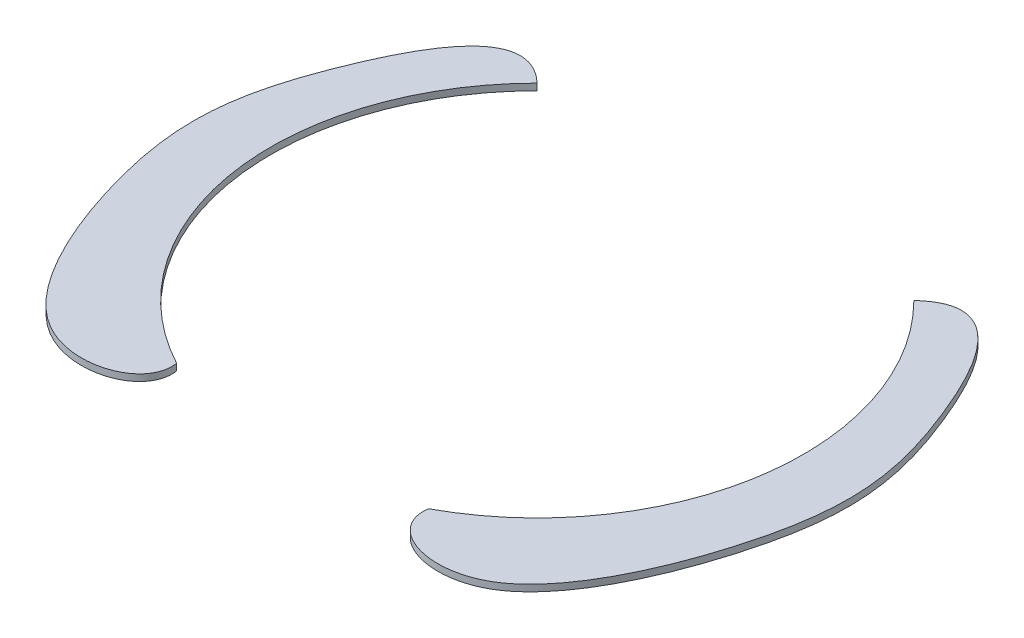
ISO-10303-21;
HEADER;
FILE_DESCRIPTION(('STEP AP214'),'2;1');
FILE_NAME('part.step','',(''),(''),'','','');
FILE_SCHEMA(('AUTOMOTIVE_DESIGN { 1 0 10303 214 1 1 1 1 }'));
ENDSEC;
DATA;
#1=APPLICATION_CONTEXT('core data for automotive mechanical design processes');
#2=APPLICATION_PROTOCOL_DEFINITION('international standard','automotive_design',2000,#1);
#3=PRODUCT_CONTEXT('',#1,'mechanical');
#4=PRODUCT('Part','Part','',(#3));
#5=PRODUCT_RELATED_PRODUCT_CATEGORY('part','',(#4));
#6=PRODUCT_DEFINITION_FORMATION('','',#4);
#7=PRODUCT_DEFINITION_CONTEXT('part definition',#1,'design');
#8=PRODUCT_DEFINITION('design','',#6,#7);
#9=PRODUCT_DEFINITION_SHAPE('','',#8);
#10=(LENGTH_UNIT() NAMED_UNIT(*) SI_UNIT(.MILLI.,.METRE.));
#11=(NAMED_UNIT(*) PLANE_ANGLE_UNIT() SI_UNIT($,.RADIAN.));
#12=(NAMED_UNIT(*) SI_UNIT($,.STERADIAN.) SOLID_ANGLE_UNIT());
#13=UNCERTAINTY_MEASURE_WITH_UNIT(LENGTH_MEASURE(1.E-05),#10,'distance_accuracy_value','');
#14=(GEOMETRIC_REPRESENTATION_CONTEXT(3) GLOBAL_UNCERTAINTY_ASSIGNED_CONTEXT((#13)) GLOBAL_UNIT_ASSIGNED_CONTEXT((#10,
#11,#12)) REPRESENTATION_CONTEXT('',''));
#15=CARTESIAN_POINT('',(0.,0.,0.));
#16=DIRECTION('',(0.,0.,1.));
#17=DIRECTION('',(1.,0.,0.));
#18=AXIS2_PLACEMENT_3D('',#15,#16,#17);
#19=CARTESIAN_POINT('',(120.169206136468,6.35,223.775248623548));
#20=CARTESIAN_POINT('',(114.802406282433,6.35,259.422683492036));
#21=CARTESIAN_POINT('',(224.970761471308,6.35,297.633699589526));
#22=CARTESIAN_POINT('',(324.66087709678,6.35,60.5381654240561));
#23=CARTESIAN_POINT('',(311.192726478503,6.35,-68.2502607321332));
#24=CARTESIAN_POINT('',(227.185128051021,6.35,-224.453544186043));
#25=CARTESIAN_POINT('',(179.605122421383,6.35,-179.605122421383));
#26=B_SPLINE_CURVE_WITH_KNOTS('',3,(#19,#20,#21,#22,#23,#24,#25),.UNSPECIFIED.,.F.,.F.,(4,1,1,1,
4),(0.,0.224498602288113,0.45738299046656,0.765524305542778,1.),.UNSPECIFIED.);
#27=DIRECTION('',(0.,-1.,0.));
#28=VECTOR('',#27,1.);
#29=SURFACE_OF_LINEAR_EXTRUSION('',#26,#28);
#30=CARTESIAN_POINT('',(120.169206136468,0.,223.775248623548));
#31=CARTESIAN_POINT('',(114.802406282433,0.,259.422683492036));
#32=CARTESIAN_POINT('',(224.970761471308,0.,297.633699589526));
#33=CARTESIAN_POINT('',(324.66087709678,0.,60.5381654240561));
#34=CARTESIAN_POINT('',(311.192726478503,0.,-68.2502607321332));
#35=CARTESIAN_POINT('',(227.185128051021,0.,-224.453544186043));
#36=CARTESIAN_POINT('',(179.605122421383,0.,-179.605122421383));
#37=B_SPLINE_CURVE_WITH_KNOTS('',3,(#30,#31,#32,#33,#34,#35,#36),.UNSPECIFIED.,.F.,.F.,(4,1,1,1,
4),(0.,0.224498602288113,0.45738299046656,0.765524305542778,1.),.UNSPECIFIED.);
#38=CARTESIAN_POINT('',(120.169206136468,0.,223.775248623549));
#39=VERTEX_POINT('',#38);
#40=CARTESIAN_POINT('',(179.605122421383,0.,-179.605122421383));
#41=VERTEX_POINT('',#40);
#42=EDGE_CURVE('E79',#39,#41,#37,.T.);
#43=ORIENTED_EDGE('',*,*,#42,.T.);
#44=DIRECTION('',(0.,-1.,0.));
#45=VECTOR('',#44,1.);
#46=CARTESIAN_POINT('',(179.605122421383,6.35,-179.605122421383));
#47=LINE('',#46,#45);
#48=CARTESIAN_POINT('',(179.605122421383,6.35,-179.605122421383));
#49=VERTEX_POINT('',#48);
#50=EDGE_CURVE('E12',#49,#41,#47,.T.);
#51=ORIENTED_EDGE('',*,*,#50,.F.);
#52=CARTESIAN_POINT('',(120.169206136468,6.35,223.775248623549));
#53=VERTEX_POINT('',#52);
#54=EDGE_CURVE('E78',#53,#49,#26,.T.);
#55=ORIENTED_EDGE('',*,*,#54,.F.);
#56=DIRECTION('',(0.,-1.,0.));
#57=VECTOR('',#56,1.);
#58=CARTESIAN_POINT('',(120.169206136468,6.35,223.775248623549));
#59=LINE('',#58,#57);
#60=EDGE_CURVE('E56',#53,#39,#59,.T.);
#61=ORIENTED_EDGE('',*,*,#60,.T.);
#62=EDGE_LOOP('',(#43,#51,#55,#61));
#63=FACE_BOUND('',#62,.T.);
#64=ADVANCED_FACE('F47',(#63),#29,.F.);
#65=CARTESIAN_POINT('',(0.,6.35,0.));
#66=DIRECTION('',(0.,-1.,0.));
#67=DIRECTION('',(0.,0.,-1.));
#68=AXIS2_PLACEMENT_3D('',#65,#66,#67);
#69=CYLINDRICAL_SURFACE('',#68,254.);
#70=CARTESIAN_POINT('',(0.,0.,0.));
#71=DIRECTION('',(0.,-1.,0.));
#72=DIRECTION('',(0.,0.,1.));
#73=AXIS2_PLACEMENT_3D('',#70,#71,#72);
#74=CIRCLE('',#73,254.);
#75=EDGE_CURVE('E71',#41,#39,#74,.T.);
#76=ORIENTED_EDGE('',*,*,#75,.T.);
#77=ORIENTED_EDGE('',*,*,#60,.F.);
#78=CARTESIAN_POINT('',(0.,6.35,0.));
#79=DIRECTION('',(0.,-1.,0.));
#80=DIRECTION('',(0.,0.,1.));
#81=AXIS2_PLACEMENT_3D('',#78,#79,#80);
#82=CIRCLE('',#81,254.);
#83=EDGE_CURVE('E63',#49,#53,#82,.T.);
#84=ORIENTED_EDGE('',*,*,#83,.F.);
#85=ORIENTED_EDGE('',*,*,#50,.T.);
#86=EDGE_LOOP('',(#76,#77,#84,#85));
#87=FACE_BOUND('',#86,.T.);
#88=ADVANCED_FACE('F74',(#87),#69,.F.);
#89=CARTESIAN_POINT('',(307.110628505821,6.35,67.8775018253853));
#90=DIRECTION('',(0.,1.,0.));
#91=DIRECTION('',(0.,0.,1.));
#92=AXIS2_PLACEMENT_3D('',#89,#90,#91);
#93=PLANE('',#92);
#94=ORIENTED_EDGE('',*,*,#54,.T.);
#95=ORIENTED_EDGE('',*,*,#83,.T.);
#96=EDGE_LOOP('',(#94,#95));
#97=FACE_BOUND('',#96,.T.);
#98=ADVANCED_FACE('F96',(#97),#93,.T.);
#99=CARTESIAN_POINT('',(307.110628505821,0.,67.8775018253853));
#100=DIRECTION('',(0.,1.,0.));
#101=DIRECTION('',(0.,0.,1.));
#102=AXIS2_PLACEMENT_3D('',#99,#100,#101);
#103=PLANE('',#102);
#104=ORIENTED_EDGE('',*,*,#42,.F.);
#105=ORIENTED_EDGE('',*,*,#75,.F.);
#106=EDGE_LOOP('',(#104,#105));
#107=FACE_BOUND('',#106,.T.);
#108=ADVANCED_FACE('F82',(#107),#103,.F.);
#109=CLOSED_SHELL('',(#64,#88,#98,#108));
#110=MANIFOLD_SOLID_BREP('B2',#109);
#111=CARTESIAN_POINT('',(-179.605122421383,6.35,-179.605122421383));
#112=CARTESIAN_POINT('',(-227.185128051021,6.35,-224.453544186043));
#113=CARTESIAN_POINT('',(-311.192726478503,6.35,-68.2502607321331));
#114=CARTESIAN_POINT('',(-324.66087709678,6.35,60.5381654240562));
#115=CARTESIAN_POINT('',(-224.970761471308,6.35,297.633699589526));
#116=CARTESIAN_POINT('',(-114.802406282433,6.35,259.422683492036));
#117=CARTESIAN_POINT('',(-120.169206136468,6.35,223.775248623549));
#118=B_SPLINE_CURVE_WITH_KNOTS('',3,(#111,#112,#113,#114,#115,#116,#117),.UNSPECIFIED.,.F.,.F.,
(4,1,1,1,4),(0.,0.234475694457222,0.54261700953344,0.775501397711887,1.),.UNSPECIFIED.);
#119=DIRECTION('',(0.,-1.,0.));
#120=VECTOR('',#119,1.);
#121=SURFACE_OF_LINEAR_EXTRUSION('',#118,#120);
#122=CARTESIAN_POINT('',(-179.605122421383,0.,-179.605122421383));
#123=CARTESIAN_POINT('',(-227.185128051021,0.,-224.453544186043));
#124=CARTESIAN_POINT('',(-311.192726478503,0.,-68.2502607321331));
#125=CARTESIAN_POINT('',(-324.66087709678,0.,60.5381654240562));
#126=CARTESIAN_POINT('',(-224.970761471308,0.,297.633699589526));
#127=CARTESIAN_POINT('',(-114.802406282433,0.,259.422683492036));
#128=CARTESIAN_POINT('',(-120.169206136468,0.,223.775248623549));
#129=B_SPLINE_CURVE_WITH_KNOTS('',3,(#122,#123,#124,#125,#126,#127,#128),.UNSPECIFIED.,.F.,.F.,
(4,1,1,1,4),(0.,0.234475694457222,0.54261700953344,0.775501397711887,1.),.UNSPECIFIED.);
#130=CARTESIAN_POINT('',(-179.605122421383,0.,-179.605122421383));
#131=VERTEX_POINT('',#130);
#132=CARTESIAN_POINT('',(-120.169206136468,0.,223.775248623549));
#133=VERTEX_POINT('',#132);
#134=EDGE_CURVE('E162',#131,#133,#129,.T.);
#135=ORIENTED_EDGE('',*,*,#134,.T.);
#136=DIRECTION('',(0.,-1.,0.));
#137=VECTOR('',#136,1.);
#138=CARTESIAN_POINT('',(-120.169206136468,6.35,223.775248623549));
#139=LINE('',#138,#137);
#140=CARTESIAN_POINT('',(-120.169206136468,6.35,223.775248623549));
#141=VERTEX_POINT('',#140);
#142=EDGE_CURVE('E45',#141,#133,#139,.T.);
#143=ORIENTED_EDGE('',*,*,#142,.F.);
#144=CARTESIAN_POINT('',(-179.605122421383,6.35,-179.605122421383));
#145=VERTEX_POINT('',#144);
#146=EDGE_CURVE('E161',#145,#141,#118,.T.);
#147=ORIENTED_EDGE('',*,*,#146,.F.);
#148=DIRECTION('',(0.,-1.,0.));
#149=VECTOR('',#148,1.);
#150=CARTESIAN_POINT('',(-179.605122421383,6.35,-179.605122421383));
#151=LINE('',#150,#149);
#152=EDGE_CURVE('E139',#145,#131,#151,.T.);
#153=ORIENTED_EDGE('',*,*,#152,.T.);
#154=EDGE_LOOP('',(#135,#143,#147,#153));
#155=FACE_BOUND('',#154,.T.);
#156=ADVANCED_FACE('F130',(#155),#121,.F.);
#157=CARTESIAN_POINT('',(0.,6.35,0.));
#158=DIRECTION('',(0.,-1.,0.));
#159=DIRECTION('',(0.,0.,-1.));
#160=AXIS2_PLACEMENT_3D('',#157,#158,#159);
#161=CYLINDRICAL_SURFACE('',#160,254.);
#162=CARTESIAN_POINT('',(0.,0.,0.));
#163=DIRECTION('',(0.,-1.,0.));
#164=DIRECTION('',(0.,0.,1.));
#165=AXIS2_PLACEMENT_3D('',#162,#163,#164);
#166=CIRCLE('',#165,254.);
#167=EDGE_CURVE('E154',#133,#131,#166,.T.);
#168=ORIENTED_EDGE('',*,*,#167,.T.);
#169=ORIENTED_EDGE('',*,*,#152,.F.);
#170=CARTESIAN_POINT('',(0.,6.35,0.));
#171=DIRECTION('',(0.,-1.,0.));
#172=DIRECTION('',(0.,0.,1.));
#173=AXIS2_PLACEMENT_3D('',#170,#171,#172);
#174=CIRCLE('',#173,254.);
#175=EDGE_CURVE('E146',#141,#145,#174,.T.);
#176=ORIENTED_EDGE('',*,*,#175,.F.);
#177=ORIENTED_EDGE('',*,*,#142,.T.);
#178=EDGE_LOOP('',(#168,#169,#176,#177));
#179=FACE_BOUND('',#178,.T.);
#180=ADVANCED_FACE('F157',(#179),#161,.F.);
#181=CARTESIAN_POINT('',(-307.110628505821,6.35,67.8775018253854));
#182=DIRECTION('',(0.,-1.,0.));
#183=DIRECTION('',(0.,0.,-1.));
#184=AXIS2_PLACEMENT_3D('',#181,#182,#183);
#185=PLANE('',#184);
#186=ORIENTED_EDGE('',*,*,#146,.T.);
#187=ORIENTED_EDGE('',*,*,#175,.T.);
#188=EDGE_LOOP('',(#186,#187));
#189=FACE_BOUND('',#188,.T.);
#190=ADVANCED_FACE('F179',(#189),#185,.F.);
#191=CARTESIAN_POINT('',(-307.110628505821,0.,67.8775018253854));
#192=DIRECTION('',(0.,-1.,0.));
#193=DIRECTION('',(0.,0.,-1.));
#194=AXIS2_PLACEMENT_3D('',#191,#192,#193);
#195=PLANE('',#194);
#196=ORIENTED_EDGE('',*,*,#134,.F.);
#197=ORIENTED_EDGE('',*,*,#167,.F.);
#198=EDGE_LOOP('',(#196,#197));
#199=FACE_BOUND('',#198,.T.);
#200=ADVANCED_FACE('F165',(#199),#195,.T.);
#201=CLOSED_SHELL('',(#156,#180,#190,#200));
#202=MANIFOLD_SOLID_BREP('B6',#201);
#203=ADVANCED_BREP_SHAPE_REPRESENTATION('',(#18,#110,#202),#14);
#204=SHAPE_DEFINITION_REPRESENTATION(#9,#203);
ENDSEC;
END-ISO-10303-21;
